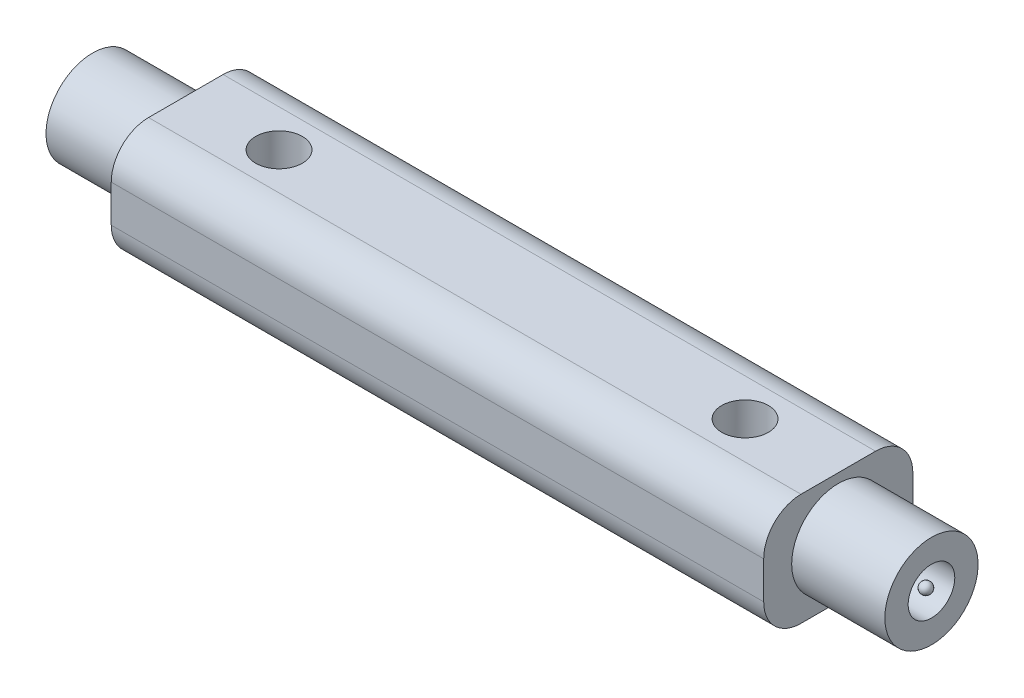
ISO-10303-21;
HEADER;
FILE_DESCRIPTION(('STEP AP214'),'2;1');
FILE_NAME('part.step','',(''),(''),'','','');
FILE_SCHEMA(('AUTOMOTIVE_DESIGN { 1 0 10303 214 1 1 1 1 }'));
ENDSEC;
DATA;
#1=APPLICATION_CONTEXT('core data for automotive mechanical design processes');
#2=APPLICATION_PROTOCOL_DEFINITION('international standard','automotive_design',2000,#1);
#3=PRODUCT_CONTEXT('',#1,'mechanical');
#4=PRODUCT('Part','Part','',(#3));
#5=PRODUCT_RELATED_PRODUCT_CATEGORY('part','',(#4));
#6=PRODUCT_DEFINITION_FORMATION('','',#4);
#7=PRODUCT_DEFINITION_CONTEXT('part definition',#1,'design');
#8=PRODUCT_DEFINITION('design','',#6,#7);
#9=PRODUCT_DEFINITION_SHAPE('','',#8);
#10=(LENGTH_UNIT() NAMED_UNIT(*) SI_UNIT(.MILLI.,.METRE.));
#11=(NAMED_UNIT(*) PLANE_ANGLE_UNIT() SI_UNIT($,.RADIAN.));
#12=(NAMED_UNIT(*) SI_UNIT($,.STERADIAN.) SOLID_ANGLE_UNIT());
#13=UNCERTAINTY_MEASURE_WITH_UNIT(LENGTH_MEASURE(1.E-05),#10,'distance_accuracy_value','');
#14=(GEOMETRIC_REPRESENTATION_CONTEXT(3) GLOBAL_UNCERTAINTY_ASSIGNED_CONTEXT((#13)) GLOBAL_UNIT_ASSIGNED_CONTEXT((#10,
#11,#12)) REPRESENTATION_CONTEXT('',''));
#15=CARTESIAN_POINT('',(0.,0.,0.));
#16=DIRECTION('',(0.,0.,1.));
#17=DIRECTION('',(1.,0.,0.));
#18=AXIS2_PLACEMENT_3D('',#15,#16,#17);
#19=CARTESIAN_POINT('',(22.2,0.,0.));
#20=DIRECTION('',(-1.,0.,0.));
#21=DIRECTION('',(0.,0.,-1.));
#22=AXIS2_PLACEMENT_3D('',#19,#20,#21);
#23=SPHERICAL_SURFACE('',#22,0.300000000000002);
#24=CARTESIAN_POINT('',(21.9,0.,0.));
#25=VERTEX_POINT('',#24);
#26=VERTEX_LOOP('',#25);
#27=FACE_BOUND('',#26,.T.);
#28=ADVANCED_FACE('F40',(#27),#23,.T.);
#29=CLOSED_SHELL('',(#28));
#30=MANIFOLD_SOLID_BREP('B2',#29);
#31=CARTESIAN_POINT('',(-22.2,0.,0.));
#32=DIRECTION('',(-1.,0.,0.));
#33=DIRECTION('',(0.,0.,-1.));
#34=AXIS2_PLACEMENT_3D('',#31,#32,#33);
#35=SPHERICAL_SURFACE('',#34,0.300000000000002);
#36=CARTESIAN_POINT('',(-22.5,0.,0.));
#37=VERTEX_POINT('',#36);
#38=VERTEX_LOOP('',#37);
#39=FACE_BOUND('',#38,.T.);
#40=ADVANCED_FACE('F62',(#39),#35,.T.);
#41=CLOSED_SHELL('',(#40));
#42=MANIFOLD_SOLID_BREP('B6',#41);
#43=CARTESIAN_POINT('',(22.5,0.,0.));
#44=DIRECTION('',(1.,0.,0.));
#45=DIRECTION('',(0.,0.,-1.));
#46=AXIS2_PLACEMENT_3D('',#43,#44,#45);
#47=CYLINDRICAL_SURFACE('',#46,1.24999999999999);
#48=CARTESIAN_POINT('',(12.5,0.,0.));
#49=DIRECTION('',(0.707106781186547,-0.707106781186547,0.));
#50=DIRECTION('',(0.707106781186547,0.707106781186547,0.));
#51=AXIS2_PLACEMENT_3D('',#48,#49,#50);
#52=ELLIPSE('',#51,1.76776695296635,1.24999999999999);
#53=CARTESIAN_POINT('',(12.5,0.,1.24999999999999));
#54=VERTEX_POINT('',#53);
#55=CARTESIAN_POINT('',(12.5,0.,-1.24999999999999));
#56=VERTEX_POINT('',#55);
#57=EDGE_CURVE('E168',#54,#56,#52,.T.);
#58=ORIENTED_EDGE('',*,*,#57,.T.);
#59=CARTESIAN_POINT('',(12.5,0.,0.));
#60=DIRECTION('',(0.707106781186547,0.707106781186547,0.));
#61=DIRECTION('',(0.707106781186547,-0.707106781186547,0.));
#62=AXIS2_PLACEMENT_3D('',#59,#60,#61);
#63=ELLIPSE('',#62,1.76776695296635,1.24999999999999);
#64=EDGE_CURVE('E165',#56,#54,#63,.T.);
#65=ORIENTED_EDGE('',*,*,#64,.T.);
#66=EDGE_LOOP('',(#58,#65));
#67=FACE_BOUND('',#66,.T.);
#68=CARTESIAN_POINT('',(-12.5,0.,0.));
#69=DIRECTION('',(0.707106781186547,-0.707106781186547,0.));
#70=DIRECTION('',(0.707106781186547,0.707106781186547,0.));
#71=AXIS2_PLACEMENT_3D('',#68,#69,#70);
#72=ELLIPSE('',#71,1.76776695296635,1.24999999999999);
#73=CARTESIAN_POINT('',(-12.5,0.,1.24999999999999));
#74=VERTEX_POINT('',#73);
#75=CARTESIAN_POINT('',(-12.5,0.,-1.24999999999999));
#76=VERTEX_POINT('',#75);
#77=EDGE_CURVE('E87',#74,#76,#72,.F.);
#78=ORIENTED_EDGE('',*,*,#77,.T.);
#79=CARTESIAN_POINT('',(-12.5,0.,0.));
#80=DIRECTION('',(0.707106781186547,0.707106781186547,0.));
#81=DIRECTION('',(0.707106781186547,-0.707106781186547,0.));
#82=AXIS2_PLACEMENT_3D('',#79,#80,#81);
#83=ELLIPSE('',#82,1.76776695296635,1.24999999999999);
#84=EDGE_CURVE('E60',#76,#74,#83,.F.);
#85=ORIENTED_EDGE('',*,*,#84,.T.);
#86=EDGE_LOOP('',(#78,#85));
#87=FACE_BOUND('',#86,.T.);
#88=ADVANCED_FACE('F74',(#67,#87),#47,.F.);
#89=CARTESIAN_POINT('',(22.5,0.,0.));
#90=DIRECTION('',(1.,0.,0.));
#91=DIRECTION('',(0.,0.,-1.));
#92=AXIS2_PLACEMENT_3D('',#89,#90,#91);
#93=CIRCLE('',#92,1.24999999999999);
#94=CARTESIAN_POINT('',(22.5,0.,-1.24999999999999));
#95=VERTEX_POINT('',#94);
#96=EDGE_CURVE('E247',#95,#95,#93,.T.);
#97=ORIENTED_EDGE('',*,*,#96,.T.);
#98=EDGE_LOOP('',(#97));
#99=FACE_BOUND('',#98,.T.);
#100=CARTESIAN_POINT('',(12.5,0.,0.));
#101=DIRECTION('',(0.707106781186547,-0.707106781186547,0.));
#102=DIRECTION('',(0.707106781186547,0.707106781186547,0.));
#103=AXIS2_PLACEMENT_3D('',#100,#101,#102);
#104=ELLIPSE('',#103,1.76776695296635,1.24999999999999);
#105=EDGE_CURVE('E94',#54,#56,#104,.F.);
#106=ORIENTED_EDGE('',*,*,#105,.T.);
#107=CARTESIAN_POINT('',(12.5,0.,0.));
#108=DIRECTION('',(0.707106781186547,0.707106781186547,0.));
#109=DIRECTION('',(0.707106781186547,-0.707106781186547,0.));
#110=AXIS2_PLACEMENT_3D('',#107,#108,#109);
#111=ELLIPSE('',#110,1.76776695296635,1.24999999999999);
#112=EDGE_CURVE('E159',#56,#54,#111,.F.);
#113=ORIENTED_EDGE('',*,*,#112,.T.);
#114=EDGE_LOOP('',(#106,#113));
#115=FACE_BOUND('',#114,.T.);
#116=ADVANCED_FACE('F311',(#99,#115),#47,.F.);
#117=CARTESIAN_POINT('',(17.5,0.,0.));
#118=DIRECTION('',(1.,0.,0.));
#119=DIRECTION('',(0.,0.,-1.));
#120=AXIS2_PLACEMENT_3D('',#117,#118,#119);
#121=PLANE('',#120);
#122=DIRECTION('',(0.,0.,-1.));
#123=VECTOR('',#122,1.);
#124=CARTESIAN_POINT('',(17.5,-3.,4.));
#125=LINE('',#124,#123);
#126=CARTESIAN_POINT('',(17.5,-3.,2.));
#127=VERTEX_POINT('',#126);
#128=CARTESIAN_POINT('',(17.5,-3.,-2.));
#129=VERTEX_POINT('',#128);
#130=EDGE_CURVE('E231',#127,#129,#125,.T.);
#131=ORIENTED_EDGE('',*,*,#130,.T.);
#132=CARTESIAN_POINT('',(17.5,-1.,-2.));
#133=DIRECTION('',(1.,0.,0.));
#134=DIRECTION('',(0.,0.,-1.));
#135=AXIS2_PLACEMENT_3D('',#132,#133,#134);
#136=CIRCLE('',#135,2.);
#137=CARTESIAN_POINT('',(17.5,-1.,-4.));
#138=VERTEX_POINT('',#137);
#139=EDGE_CURVE('E182',#129,#138,#136,.T.);
#140=ORIENTED_EDGE('',*,*,#139,.T.);
#141=DIRECTION('',(0.,1.,0.));
#142=VECTOR('',#141,1.);
#143=CARTESIAN_POINT('',(17.5,3.,-4.));
#144=LINE('',#143,#142);
#145=CARTESIAN_POINT('',(17.5,1.,-4.));
#146=VERTEX_POINT('',#145);
#147=EDGE_CURVE('E228',#138,#146,#144,.T.);
#148=ORIENTED_EDGE('',*,*,#147,.T.);
#149=CARTESIAN_POINT('',(17.5,1.,-2.));
#150=DIRECTION('',(1.,0.,0.));
#151=DIRECTION('',(0.,0.,-1.));
#152=AXIS2_PLACEMENT_3D('',#149,#150,#151);
#153=CIRCLE('',#152,2.);
#154=CARTESIAN_POINT('',(17.5,3.,-2.));
#155=VERTEX_POINT('',#154);
#156=EDGE_CURVE('E184',#146,#155,#153,.T.);
#157=ORIENTED_EDGE('',*,*,#156,.T.);
#158=DIRECTION('',(0.,0.,1.));
#159=VECTOR('',#158,1.);
#160=CARTESIAN_POINT('',(17.5,3.,4.));
#161=LINE('',#160,#159);
#162=CARTESIAN_POINT('',(17.5,3.,2.));
#163=VERTEX_POINT('',#162);
#164=EDGE_CURVE('E211',#155,#163,#161,.T.);
#165=ORIENTED_EDGE('',*,*,#164,.T.);
#166=CARTESIAN_POINT('',(17.5,1.,2.));
#167=DIRECTION('',(1.,0.,0.));
#168=DIRECTION('',(0.,0.,-1.));
#169=AXIS2_PLACEMENT_3D('',#166,#167,#168);
#170=CIRCLE('',#169,2.);
#171=CARTESIAN_POINT('',(17.5,1.,4.));
#172=VERTEX_POINT('',#171);
#173=EDGE_CURVE('E188',#163,#172,#170,.T.);
#174=ORIENTED_EDGE('',*,*,#173,.T.);
#175=DIRECTION('',(0.,-1.,0.));
#176=VECTOR('',#175,1.);
#177=CARTESIAN_POINT('',(17.5,3.,4.));
#178=LINE('',#177,#176);
#179=CARTESIAN_POINT('',(17.5,-1.,4.));
#180=VERTEX_POINT('',#179);
#181=EDGE_CURVE('E215',#172,#180,#178,.T.);
#182=ORIENTED_EDGE('',*,*,#181,.T.);
#183=CARTESIAN_POINT('',(17.5,-1.,2.));
#184=DIRECTION('',(1.,0.,0.));
#185=DIRECTION('',(0.,0.,-1.));
#186=AXIS2_PLACEMENT_3D('',#183,#184,#185);
#187=CIRCLE('',#186,2.);
#188=EDGE_CURVE('E186',#180,#127,#187,.T.);
#189=ORIENTED_EDGE('',*,*,#188,.T.);
#190=EDGE_LOOP('',(#131,#140,#148,#157,#165,#174,#182,#189));
#191=FACE_BOUND('',#190,.T.);
#192=CARTESIAN_POINT('',(17.5,0.,0.));
#193=DIRECTION('',(1.,0.,0.));
#194=DIRECTION('',(0.,0.,-1.));
#195=AXIS2_PLACEMENT_3D('',#192,#193,#194);
#196=CIRCLE('',#195,2.5);
#197=CARTESIAN_POINT('',(17.5,0.,2.5));
#198=VERTEX_POINT('',#197);
#199=EDGE_CURVE('E225',#198,#198,#196,.F.);
#200=ORIENTED_EDGE('',*,*,#199,.T.);
#201=EDGE_LOOP('',(#200));
#202=FACE_BOUND('',#201,.T.);
#203=ADVANCED_FACE('F308',(#191,#202),#121,.T.);
#204=CARTESIAN_POINT('',(-17.5,0.,0.));
#205=DIRECTION('',(1.,0.,0.));
#206=DIRECTION('',(0.,0.,-1.));
#207=AXIS2_PLACEMENT_3D('',#204,#205,#206);
#208=PLANE('',#207);
#209=DIRECTION('',(0.,1.,0.));
#210=VECTOR('',#209,1.);
#211=CARTESIAN_POINT('',(-17.5,3.,-4.));
#212=LINE('',#211,#210);
#213=CARTESIAN_POINT('',(-17.5,-1.,-4.));
#214=VERTEX_POINT('',#213);
#215=CARTESIAN_POINT('',(-17.5,1.,-4.));
#216=VERTEX_POINT('',#215);
#217=EDGE_CURVE('E216',#214,#216,#212,.T.);
#218=ORIENTED_EDGE('',*,*,#217,.F.);
#219=CARTESIAN_POINT('',(-17.5,-1.,-2.));
#220=DIRECTION('',(1.,0.,0.));
#221=DIRECTION('',(0.,0.,-1.));
#222=AXIS2_PLACEMENT_3D('',#219,#220,#221);
#223=CIRCLE('',#222,2.);
#224=CARTESIAN_POINT('',(-17.5,-3.,-2.));
#225=VERTEX_POINT('',#224);
#226=EDGE_CURVE('E195',#214,#225,#223,.F.);
#227=ORIENTED_EDGE('',*,*,#226,.T.);
#228=DIRECTION('',(0.,0.,-1.));
#229=VECTOR('',#228,1.);
#230=CARTESIAN_POINT('',(-17.5,-3.,4.));
#231=LINE('',#230,#229);
#232=CARTESIAN_POINT('',(-17.5,-3.,2.));
#233=VERTEX_POINT('',#232);
#234=EDGE_CURVE('E219',#233,#225,#231,.T.);
#235=ORIENTED_EDGE('',*,*,#234,.F.);
#236=CARTESIAN_POINT('',(-17.5,-1.,2.));
#237=DIRECTION('',(1.,0.,0.));
#238=DIRECTION('',(0.,0.,-1.));
#239=AXIS2_PLACEMENT_3D('',#236,#237,#238);
#240=CIRCLE('',#239,2.);
#241=CARTESIAN_POINT('',(-17.5,-1.,4.));
#242=VERTEX_POINT('',#241);
#243=EDGE_CURVE('E199',#233,#242,#240,.F.);
#244=ORIENTED_EDGE('',*,*,#243,.T.);
#245=DIRECTION('',(0.,-1.,0.));
#246=VECTOR('',#245,1.);
#247=CARTESIAN_POINT('',(-17.5,3.,4.));
#248=LINE('',#247,#246);
#249=CARTESIAN_POINT('',(-17.5,1.,4.));
#250=VERTEX_POINT('',#249);
#251=EDGE_CURVE('E222',#250,#242,#248,.T.);
#252=ORIENTED_EDGE('',*,*,#251,.F.);
#253=CARTESIAN_POINT('',(-17.5,1.,2.));
#254=DIRECTION('',(1.,0.,0.));
#255=DIRECTION('',(0.,0.,-1.));
#256=AXIS2_PLACEMENT_3D('',#253,#254,#255);
#257=CIRCLE('',#256,2.);
#258=CARTESIAN_POINT('',(-17.5,3.,2.));
#259=VERTEX_POINT('',#258);
#260=EDGE_CURVE('E201',#250,#259,#257,.F.);
#261=ORIENTED_EDGE('',*,*,#260,.T.);
#262=DIRECTION('',(0.,0.,1.));
#263=VECTOR('',#262,1.);
#264=CARTESIAN_POINT('',(-17.5,3.,4.));
#265=LINE('',#264,#263);
#266=CARTESIAN_POINT('',(-17.5,3.,-2.));
#267=VERTEX_POINT('',#266);
#268=EDGE_CURVE('E212',#267,#259,#265,.T.);
#269=ORIENTED_EDGE('',*,*,#268,.F.);
#270=CARTESIAN_POINT('',(-17.5,1.,-2.));
#271=DIRECTION('',(1.,0.,0.));
#272=DIRECTION('',(0.,0.,-1.));
#273=AXIS2_PLACEMENT_3D('',#270,#271,#272);
#274=CIRCLE('',#273,2.);
#275=EDGE_CURVE('E197',#267,#216,#274,.F.);
#276=ORIENTED_EDGE('',*,*,#275,.T.);
#277=EDGE_LOOP('',(#218,#227,#235,#244,#252,#261,#269,#276));
#278=FACE_BOUND('',#277,.T.);
#279=CARTESIAN_POINT('',(-17.5,0.,0.));
#280=DIRECTION('',(1.,0.,0.));
#281=DIRECTION('',(0.,0.,-1.));
#282=AXIS2_PLACEMENT_3D('',#279,#280,#281);
#283=CIRCLE('',#282,2.5);
#284=CARTESIAN_POINT('',(-17.5,0.,2.5));
#285=VERTEX_POINT('',#284);
#286=EDGE_CURVE('E208',#285,#285,#283,.F.);
#287=ORIENTED_EDGE('',*,*,#286,.F.);
#288=EDGE_LOOP('',(#287));
#289=FACE_BOUND('',#288,.T.);
#290=ADVANCED_FACE('F284',(#278,#289),#208,.F.);
#291=CARTESIAN_POINT('',(17.5,3.,4.));
#292=DIRECTION('',(0.,0.,-1.));
#293=DIRECTION('',(-1.,0.,0.));
#294=AXIS2_PLACEMENT_3D('',#291,#292,#293);
#295=PLANE('',#294);
#296=ORIENTED_EDGE('',*,*,#251,.T.);
#297=DIRECTION('',(-1.,0.,0.));
#298=VECTOR('',#297,1.);
#299=CARTESIAN_POINT('',(17.5,-1.,4.));
#300=LINE('',#299,#298);
#301=EDGE_CURVE('E172',#242,#180,#300,.F.);
#302=ORIENTED_EDGE('',*,*,#301,.T.);
#303=ORIENTED_EDGE('',*,*,#181,.F.);
#304=DIRECTION('',(-1.,0.,0.));
#305=VECTOR('',#304,1.);
#306=CARTESIAN_POINT('',(17.5,1.,4.));
#307=LINE('',#306,#305);
#308=EDGE_CURVE('E174',#172,#250,#307,.T.);
#309=ORIENTED_EDGE('',*,*,#308,.T.);
#310=EDGE_LOOP('',(#296,#302,#303,#309));
#311=FACE_BOUND('',#310,.T.);
#312=ADVANCED_FACE('F304',(#311),#295,.F.);
#313=CARTESIAN_POINT('',(17.5,-3.,4.));
#314=DIRECTION('',(0.,1.,0.));
#315=DIRECTION('',(0.,0.,1.));
#316=AXIS2_PLACEMENT_3D('',#313,#314,#315);
#317=PLANE('',#316);
#318=CARTESIAN_POINT('',(-12.5,-3.,0.));
#319=DIRECTION('',(0.,1.,0.));
#320=DIRECTION('',(0.,0.,1.));
#321=AXIS2_PLACEMENT_3D('',#318,#319,#320);
#322=CIRCLE('',#321,1.24999999999999);
#323=CARTESIAN_POINT('',(-12.5,-3.,1.24999999999999));
#324=VERTEX_POINT('',#323);
#325=EDGE_CURVE('E256',#324,#324,#322,.T.);
#326=ORIENTED_EDGE('',*,*,#325,.T.);
#327=EDGE_LOOP('',(#326));
#328=FACE_BOUND('',#327,.T.);
#329=CARTESIAN_POINT('',(12.5,-3.,0.));
#330=DIRECTION('',(0.,1.,0.));
#331=DIRECTION('',(0.,0.,1.));
#332=AXIS2_PLACEMENT_3D('',#329,#330,#331);
#333=CIRCLE('',#332,1.24999999999999);
#334=CARTESIAN_POINT('',(12.5,-3.,1.24999999999999));
#335=VERTEX_POINT('',#334);
#336=EDGE_CURVE('E250',#335,#335,#333,.T.);
#337=ORIENTED_EDGE('',*,*,#336,.T.);
#338=EDGE_LOOP('',(#337));
#339=FACE_BOUND('',#338,.T.);
#340=ORIENTED_EDGE('',*,*,#234,.T.);
#341=DIRECTION('',(-1.,0.,0.));
#342=VECTOR('',#341,1.);
#343=CARTESIAN_POINT('',(17.5,-3.,-2.));
#344=LINE('',#343,#342);
#345=EDGE_CURVE('E190',#225,#129,#344,.F.);
#346=ORIENTED_EDGE('',*,*,#345,.T.);
#347=ORIENTED_EDGE('',*,*,#130,.F.);
#348=DIRECTION('',(-1.,0.,0.));
#349=VECTOR('',#348,1.);
#350=CARTESIAN_POINT('',(17.5,-3.,2.));
#351=LINE('',#350,#349);
#352=EDGE_CURVE('E192',#127,#233,#351,.T.);
#353=ORIENTED_EDGE('',*,*,#352,.T.);
#354=EDGE_LOOP('',(#340,#346,#347,#353));
#355=FACE_BOUND('',#354,.T.);
#356=ADVANCED_FACE('F295',(#328,#339,#355),#317,.F.);
#357=CARTESIAN_POINT('',(17.5,3.,-4.));
#358=DIRECTION('',(0.,0.,1.));
#359=DIRECTION('',(1.,0.,0.));
#360=AXIS2_PLACEMENT_3D('',#357,#358,#359);
#361=PLANE('',#360);
#362=ORIENTED_EDGE('',*,*,#147,.F.);
#363=DIRECTION('',(-1.,0.,0.));
#364=VECTOR('',#363,1.);
#365=CARTESIAN_POINT('',(17.5,-1.,-4.));
#366=LINE('',#365,#364);
#367=EDGE_CURVE('E203',#138,#214,#366,.T.);
#368=ORIENTED_EDGE('',*,*,#367,.T.);
#369=ORIENTED_EDGE('',*,*,#217,.T.);
#370=DIRECTION('',(-1.,0.,0.));
#371=VECTOR('',#370,1.);
#372=CARTESIAN_POINT('',(17.5,1.,-4.));
#373=LINE('',#372,#371);
#374=EDGE_CURVE('E206',#216,#146,#373,.F.);
#375=ORIENTED_EDGE('',*,*,#374,.T.);
#376=EDGE_LOOP('',(#362,#368,#369,#375));
#377=FACE_BOUND('',#376,.T.);
#378=ADVANCED_FACE('F268',(#377),#361,.F.);
#379=CARTESIAN_POINT('',(17.5,3.,4.));
#380=DIRECTION('',(0.,-1.,0.));
#381=DIRECTION('',(0.,0.,-1.));
#382=AXIS2_PLACEMENT_3D('',#379,#380,#381);
#383=PLANE('',#382);
#384=CARTESIAN_POINT('',(-12.5,3.,0.));
#385=DIRECTION('',(0.,1.,0.));
#386=DIRECTION('',(0.,0.,1.));
#387=AXIS2_PLACEMENT_3D('',#384,#385,#386);
#388=CIRCLE('',#387,1.24999999999999);
#389=CARTESIAN_POINT('',(-12.5,3.,1.24999999999999));
#390=VERTEX_POINT('',#389);
#391=EDGE_CURVE('E259',#390,#390,#388,.T.);
#392=ORIENTED_EDGE('',*,*,#391,.F.);
#393=EDGE_LOOP('',(#392));
#394=FACE_BOUND('',#393,.T.);
#395=CARTESIAN_POINT('',(12.5,3.,0.));
#396=DIRECTION('',(0.,1.,0.));
#397=DIRECTION('',(0.,0.,1.));
#398=AXIS2_PLACEMENT_3D('',#395,#396,#397);
#399=CIRCLE('',#398,1.24999999999999);
#400=CARTESIAN_POINT('',(12.5,3.,1.24999999999999));
#401=VERTEX_POINT('',#400);
#402=EDGE_CURVE('E253',#401,#401,#399,.T.);
#403=ORIENTED_EDGE('',*,*,#402,.F.);
#404=EDGE_LOOP('',(#403));
#405=FACE_BOUND('',#404,.T.);
#406=ORIENTED_EDGE('',*,*,#164,.F.);
#407=DIRECTION('',(-1.,0.,0.));
#408=VECTOR('',#407,1.);
#409=CARTESIAN_POINT('',(17.5,3.,-2.));
#410=LINE('',#409,#408);
#411=EDGE_CURVE('E177',#155,#267,#410,.T.);
#412=ORIENTED_EDGE('',*,*,#411,.T.);
#413=ORIENTED_EDGE('',*,*,#268,.T.);
#414=DIRECTION('',(-1.,0.,0.));
#415=VECTOR('',#414,1.);
#416=CARTESIAN_POINT('',(17.5,3.,2.));
#417=LINE('',#416,#415);
#418=EDGE_CURVE('E180',#259,#163,#417,.F.);
#419=ORIENTED_EDGE('',*,*,#418,.T.);
#420=EDGE_LOOP('',(#406,#412,#413,#419));
#421=FACE_BOUND('',#420,.T.);
#422=ADVANCED_FACE('F264',(#394,#405,#421),#383,.F.);
#423=CARTESIAN_POINT('',(-22.5,0.,0.));
#424=DIRECTION('',(1.,0.,0.));
#425=DIRECTION('',(0.,0.,-1.));
#426=AXIS2_PLACEMENT_3D('',#423,#424,#425);
#427=PLANE('',#426);
#428=CARTESIAN_POINT('',(-22.5,0.,0.));
#429=DIRECTION('',(1.,0.,0.));
#430=DIRECTION('',(0.,0.,-1.));
#431=AXIS2_PLACEMENT_3D('',#428,#429,#430);
#432=CIRCLE('',#431,1.24999999999999);
#433=CARTESIAN_POINT('',(-22.5,0.,-1.24999999999999));
#434=VERTEX_POINT('',#433);
#435=EDGE_CURVE('E242',#434,#434,#432,.T.);
#436=ORIENTED_EDGE('',*,*,#435,.T.);
#437=EDGE_LOOP('',(#436));
#438=FACE_BOUND('',#437,.T.);
#439=CARTESIAN_POINT('',(-22.5,0.,0.));
#440=DIRECTION('',(1.,0.,0.));
#441=DIRECTION('',(0.,0.,-1.));
#442=AXIS2_PLACEMENT_3D('',#439,#440,#441);
#443=CIRCLE('',#442,2.5);
#444=CARTESIAN_POINT('',(-22.5,0.,2.5));
#445=VERTEX_POINT('',#444);
#446=EDGE_CURVE('E239',#445,#445,#443,.T.);
#447=ORIENTED_EDGE('',*,*,#446,.F.);
#448=EDGE_LOOP('',(#447));
#449=FACE_BOUND('',#448,.T.);
#450=ADVANCED_FACE('F267',(#438,#449),#427,.F.);
#451=CARTESIAN_POINT('',(22.5,0.,0.));
#452=DIRECTION('',(-1.,0.,0.));
#453=DIRECTION('',(0.,0.,1.));
#454=AXIS2_PLACEMENT_3D('',#451,#452,#453);
#455=CYLINDRICAL_SURFACE('',#454,2.5);
#456=CARTESIAN_POINT('',(-22.5,0.,2.5));
#457=CARTESIAN_POINT('',(-22.4479166666667,0.,2.5));
#458=CARTESIAN_POINT('',(-22.3958333333333,0.,2.5));
#459=CARTESIAN_POINT('',(-22.2916666666667,0.,2.5));
#460=CARTESIAN_POINT('',(-22.2395833333333,0.,2.5));
#461=CARTESIAN_POINT('',(-22.1354166666667,0.,2.5));
#462=CARTESIAN_POINT('',(-22.0833333333333,0.,2.5));
#463=CARTESIAN_POINT('',(-21.9791666666667,0.,2.5));
#464=CARTESIAN_POINT('',(-21.9270833333333,0.,2.5));
#465=CARTESIAN_POINT('',(-21.8229166666667,0.,2.5));
#466=CARTESIAN_POINT('',(-21.7708333333333,0.,2.5));
#467=CARTESIAN_POINT('',(-21.6666666666667,0.,2.5));
#468=CARTESIAN_POINT('',(-21.6145833333333,0.,2.5));
#469=CARTESIAN_POINT('',(-21.5104166666667,0.,2.5));
#470=CARTESIAN_POINT('',(-21.4583333333333,0.,2.5));
#471=CARTESIAN_POINT('',(-21.3541666666667,0.,2.5));
#472=CARTESIAN_POINT('',(-21.3020833333333,0.,2.5));
#473=CARTESIAN_POINT('',(-21.1979166666667,0.,2.5));
#474=CARTESIAN_POINT('',(-21.1458333333333,0.,2.5));
#475=CARTESIAN_POINT('',(-21.0416666666667,0.,2.5));
#476=CARTESIAN_POINT('',(-20.9895833333333,0.,2.5));
#477=CARTESIAN_POINT('',(-20.8854166666667,0.,2.5));
#478=CARTESIAN_POINT('',(-20.8333333333333,0.,2.5));
#479=CARTESIAN_POINT('',(-20.7291666666667,0.,2.5));
#480=CARTESIAN_POINT('',(-20.6770833333333,0.,2.5));
#481=CARTESIAN_POINT('',(-20.5729166666667,0.,2.5));
#482=CARTESIAN_POINT('',(-20.5208333333333,0.,2.5));
#483=CARTESIAN_POINT('',(-20.4166666666667,0.,2.5));
#484=CARTESIAN_POINT('',(-20.3645833333333,0.,2.5));
#485=CARTESIAN_POINT('',(-20.2604166666667,0.,2.5));
#486=CARTESIAN_POINT('',(-20.2083333333333,0.,2.5));
#487=CARTESIAN_POINT('',(-20.1041666666667,0.,2.5));
#488=CARTESIAN_POINT('',(-20.0520833333333,0.,2.5));
#489=CARTESIAN_POINT('',(-19.9479166666667,0.,2.5));
#490=CARTESIAN_POINT('',(-19.8958333333333,0.,2.5));
#491=CARTESIAN_POINT('',(-19.7916666666667,0.,2.5));
#492=CARTESIAN_POINT('',(-19.7395833333333,0.,2.5));
#493=CARTESIAN_POINT('',(-19.6354166666667,0.,2.5));
#494=CARTESIAN_POINT('',(-19.5833333333333,0.,2.5));
#495=CARTESIAN_POINT('',(-19.4791666666667,0.,2.5));
#496=CARTESIAN_POINT('',(-19.4270833333333,0.,2.5));
#497=CARTESIAN_POINT('',(-19.3229166666667,0.,2.5));
#498=CARTESIAN_POINT('',(-19.2708333333333,0.,2.5));
#499=CARTESIAN_POINT('',(-19.1666666666667,0.,2.5));
#500=CARTESIAN_POINT('',(-19.1145833333333,0.,2.5));
#501=CARTESIAN_POINT('',(-19.0104166666667,0.,2.5));
#502=CARTESIAN_POINT('',(-18.9583333333333,0.,2.5));
#503=CARTESIAN_POINT('',(-18.8541666666667,0.,2.5));
#504=CARTESIAN_POINT('',(-18.8020833333333,0.,2.5));
#505=CARTESIAN_POINT('',(-18.6979166666667,0.,2.5));
#506=CARTESIAN_POINT('',(-18.6458333333333,0.,2.5));
#507=CARTESIAN_POINT('',(-18.5416666666667,0.,2.5));
#508=CARTESIAN_POINT('',(-18.4895833333333,0.,2.5));
#509=CARTESIAN_POINT('',(-18.3854166666667,0.,2.5));
#510=CARTESIAN_POINT('',(-18.3333333333333,0.,2.5));
#511=CARTESIAN_POINT('',(-18.2291666666667,0.,2.5));
#512=CARTESIAN_POINT('',(-18.1770833333333,0.,2.5));
#513=CARTESIAN_POINT('',(-18.0729166666667,0.,2.5));
#514=CARTESIAN_POINT('',(-18.0208333333333,0.,2.5));
#515=CARTESIAN_POINT('',(-17.9166666666667,0.,2.5));
#516=CARTESIAN_POINT('',(-17.8645833333333,0.,2.5));
#517=CARTESIAN_POINT('',(-17.7604166666667,0.,2.5));
#518=CARTESIAN_POINT('',(-17.7083333333333,0.,2.5));
#519=CARTESIAN_POINT('',(-17.6041666666667,0.,2.5));
#520=CARTESIAN_POINT('',(-17.5520833333333,0.,2.5));
#521=CARTESIAN_POINT('',(-17.5,0.,2.5));
#522=B_SPLINE_CURVE_WITH_KNOTS('',3,(#456,#457,#458,#459,#460,#461,#462,#463,#464,#465,#466,
#467,#468,#469,#470,#471,#472,#473,#474,#475,#476,#477,#478,#479,#480,#481,#482,#483,#484,#485,
#486,#487,#488,#489,#490,#491,#492,#493,#494,#495,#496,#497,#498,#499,#500,#501,#502,#503,#504,
#505,#506,#507,#508,#509,#510,#511,#512,#513,#514,#515,#516,#517,#518,#519,#520,#521),
.UNSPECIFIED.,.F.,.F.,(4,2,2,2,2,2,2,2,2,2,2,2,2,2,2,2,2,2,2,2,2,2,2,2,2,2,2,2,2,2,2,2,4),(0.,
0.156249999999997,0.3125,0.468750000000004,0.625000000000001,0.781249999999997,
0.937500000000001,1.09375,1.25,1.40625,1.5625,1.71875,1.875,2.03125,2.1875,2.34375000000001,2.5,
2.65625,2.8125,2.96875000000001,3.125,3.28125,3.4375,3.59375000000001,3.75,3.90625,4.0625,
4.21875000000001,4.375,4.53125,4.6875,4.84375000000001,5.),.UNSPECIFIED.);
#523=EDGE_CURVE('BSEAM319',#445,#285,#522,.T.);
#524=ORIENTED_EDGE('',*,*,#446,.T.);
#525=ORIENTED_EDGE('',*,*,#286,.T.);
#526=ORIENTED_EDGE('',*,*,#523,.T.);
#527=ORIENTED_EDGE('',*,*,#523,.F.);
#528=EDGE_LOOP('',(#524,#526,#525,#527));
#529=FACE_BOUND('',#528,.T.);
#530=ADVANCED_FACE('F319',(#529),#455,.T.);
#531=CARTESIAN_POINT('',(22.5,0.,0.));
#532=DIRECTION('',(1.,0.,0.));
#533=DIRECTION('',(0.,0.,-1.));
#534=AXIS2_PLACEMENT_3D('',#531,#532,#533);
#535=CIRCLE('',#534,2.5);
#536=CARTESIAN_POINT('',(22.5,0.,2.5));
#537=VERTEX_POINT('',#536);
#538=EDGE_CURVE('E238',#537,#537,#535,.T.);
#539=CARTESIAN_POINT('',(17.5,0.,2.5));
#540=CARTESIAN_POINT('',(17.5520833333333,0.,2.5));
#541=CARTESIAN_POINT('',(17.6041666666667,0.,2.5));
#542=CARTESIAN_POINT('',(17.7083333333333,0.,2.5));
#543=CARTESIAN_POINT('',(17.7604166666667,0.,2.5));
#544=CARTESIAN_POINT('',(17.8645833333333,0.,2.5));
#545=CARTESIAN_POINT('',(17.9166666666667,0.,2.5));
#546=CARTESIAN_POINT('',(18.0208333333333,0.,2.5));
#547=CARTESIAN_POINT('',(18.0729166666667,0.,2.5));
#548=CARTESIAN_POINT('',(18.1770833333333,0.,2.5));
#549=CARTESIAN_POINT('',(18.2291666666667,0.,2.5));
#550=CARTESIAN_POINT('',(18.3333333333333,0.,2.5));
#551=CARTESIAN_POINT('',(18.3854166666667,0.,2.5));
#552=CARTESIAN_POINT('',(18.4895833333333,0.,2.5));
#553=CARTESIAN_POINT('',(18.5416666666667,0.,2.5));
#554=CARTESIAN_POINT('',(18.6458333333333,0.,2.5));
#555=CARTESIAN_POINT('',(18.6979166666667,0.,2.5));
#556=CARTESIAN_POINT('',(18.8020833333333,0.,2.5));
#557=CARTESIAN_POINT('',(18.8541666666667,0.,2.5));
#558=CARTESIAN_POINT('',(18.9583333333333,0.,2.5));
#559=CARTESIAN_POINT('',(19.0104166666667,0.,2.5));
#560=CARTESIAN_POINT('',(19.1145833333333,0.,2.5));
#561=CARTESIAN_POINT('',(19.1666666666667,0.,2.5));
#562=CARTESIAN_POINT('',(19.2708333333333,0.,2.5));
#563=CARTESIAN_POINT('',(19.3229166666667,0.,2.5));
#564=CARTESIAN_POINT('',(19.4270833333333,0.,2.5));
#565=CARTESIAN_POINT('',(19.4791666666667,0.,2.5));
#566=CARTESIAN_POINT('',(19.5833333333333,0.,2.5));
#567=CARTESIAN_POINT('',(19.6354166666667,0.,2.5));
#568=CARTESIAN_POINT('',(19.7395833333333,0.,2.5));
#569=CARTESIAN_POINT('',(19.7916666666667,0.,2.5));
#570=CARTESIAN_POINT('',(19.8958333333333,0.,2.5));
#571=CARTESIAN_POINT('',(19.9479166666667,0.,2.5));
#572=CARTESIAN_POINT('',(20.0520833333333,0.,2.5));
#573=CARTESIAN_POINT('',(20.1041666666667,0.,2.5));
#574=CARTESIAN_POINT('',(20.2083333333333,0.,2.5));
#575=CARTESIAN_POINT('',(20.2604166666667,0.,2.5));
#576=CARTESIAN_POINT('',(20.3645833333333,0.,2.5));
#577=CARTESIAN_POINT('',(20.4166666666667,0.,2.5));
#578=CARTESIAN_POINT('',(20.5208333333333,0.,2.5));
#579=CARTESIAN_POINT('',(20.5729166666667,0.,2.5));
#580=CARTESIAN_POINT('',(20.6770833333333,0.,2.5));
#581=CARTESIAN_POINT('',(20.7291666666667,0.,2.5));
#582=CARTESIAN_POINT('',(20.8333333333333,0.,2.5));
#583=CARTESIAN_POINT('',(20.8854166666667,0.,2.5));
#584=CARTESIAN_POINT('',(20.9895833333333,0.,2.5));
#585=CARTESIAN_POINT('',(21.0416666666667,0.,2.5));
#586=CARTESIAN_POINT('',(21.1458333333333,0.,2.5));
#587=CARTESIAN_POINT('',(21.1979166666667,0.,2.5));
#588=CARTESIAN_POINT('',(21.3020833333333,0.,2.5));
#589=CARTESIAN_POINT('',(21.3541666666667,0.,2.5));
#590=CARTESIAN_POINT('',(21.4583333333333,0.,2.5));
#591=CARTESIAN_POINT('',(21.5104166666667,0.,2.5));
#592=CARTESIAN_POINT('',(21.6145833333333,0.,2.5));
#593=CARTESIAN_POINT('',(21.6666666666667,0.,2.5));
#594=CARTESIAN_POINT('',(21.7708333333333,0.,2.5));
#595=CARTESIAN_POINT('',(21.8229166666667,0.,2.5));
#596=CARTESIAN_POINT('',(21.9270833333333,0.,2.5));
#597=CARTESIAN_POINT('',(21.9791666666667,0.,2.5));
#598=CARTESIAN_POINT('',(22.0833333333333,0.,2.5));
#599=CARTESIAN_POINT('',(22.1354166666667,0.,2.5));
#600=CARTESIAN_POINT('',(22.2395833333333,0.,2.5));
#601=CARTESIAN_POINT('',(22.2916666666667,0.,2.5));
#602=CARTESIAN_POINT('',(22.3958333333333,0.,2.5));
#603=CARTESIAN_POINT('',(22.4479166666667,0.,2.5));
#604=CARTESIAN_POINT('',(22.5,0.,2.5));
#605=B_SPLINE_CURVE_WITH_KNOTS('',3,(#539,#540,#541,#542,#543,#544,#545,#546,#547,#548,#549,
#550,#551,#552,#553,#554,#555,#556,#557,#558,#559,#560,#561,#562,#563,#564,#565,#566,#567,#568,
#569,#570,#571,#572,#573,#574,#575,#576,#577,#578,#579,#580,#581,#582,#583,#584,#585,#586,#587,
#588,#589,#590,#591,#592,#593,#594,#595,#596,#597,#598,#599,#600,#601,#602,#603,#604),
.UNSPECIFIED.,.F.,.F.,(4,2,2,2,2,2,2,2,2,2,2,2,2,2,2,2,2,2,2,2,2,2,2,2,2,2,2,2,2,2,2,2,4),(0.,
0.15625,0.3125,0.46875,0.625000000000001,0.781250000000001,0.937500000000001,1.09375,1.25,
1.40625,1.5625,1.71875,1.875,2.03125,2.1875,2.34375,2.5,2.65625,2.8125,2.96875,3.125,3.28125,
3.4375,3.59375,3.75,3.90625,4.0625,4.21875,4.375,4.53125,4.6875,4.84375,5.),.UNSPECIFIED.);
#606=EDGE_CURVE('BSEAM315',#198,#537,#605,.T.);
#607=ORIENTED_EDGE('',*,*,#199,.F.);
#608=ORIENTED_EDGE('',*,*,#538,.F.);
#609=ORIENTED_EDGE('',*,*,#606,.T.);
#610=ORIENTED_EDGE('',*,*,#606,.F.);
#611=EDGE_LOOP('',(#607,#609,#608,#610));
#612=FACE_BOUND('',#611,.T.);
#613=ADVANCED_FACE('F315',(#612),#455,.T.);
#614=CARTESIAN_POINT('',(22.5,0.,0.));
#615=DIRECTION('',(1.,0.,0.));
#616=DIRECTION('',(0.,0.,-1.));
#617=AXIS2_PLACEMENT_3D('',#614,#615,#616);
#618=PLANE('',#617);
#619=ORIENTED_EDGE('',*,*,#96,.F.);
#620=EDGE_LOOP('',(#619));
#621=FACE_BOUND('',#620,.T.);
#622=ORIENTED_EDGE('',*,*,#538,.T.);
#623=EDGE_LOOP('',(#622));
#624=FACE_BOUND('',#623,.T.);
#625=ADVANCED_FACE('F318',(#621,#624),#618,.T.);
#626=CARTESIAN_POINT('',(17.5,-1.,-2.));
#627=DIRECTION('',(-1.,0.,0.));
#628=DIRECTION('',(0.,0.,1.));
#629=AXIS2_PLACEMENT_3D('',#626,#627,#628);
#630=CYLINDRICAL_SURFACE('',#629,2.);
#631=ORIENTED_EDGE('',*,*,#139,.F.);
#632=ORIENTED_EDGE('',*,*,#345,.F.);
#633=ORIENTED_EDGE('',*,*,#226,.F.);
#634=ORIENTED_EDGE('',*,*,#367,.F.);
#635=EDGE_LOOP('',(#631,#632,#633,#634));
#636=FACE_BOUND('',#635,.T.);
#637=ADVANCED_FACE('F291',(#636),#630,.T.);
#638=CARTESIAN_POINT('',(17.5,1.,-2.));
#639=DIRECTION('',(-1.,0.,0.));
#640=DIRECTION('',(0.,0.,1.));
#641=AXIS2_PLACEMENT_3D('',#638,#639,#640);
#642=CYLINDRICAL_SURFACE('',#641,2.);
#643=ORIENTED_EDGE('',*,*,#156,.F.);
#644=ORIENTED_EDGE('',*,*,#374,.F.);
#645=ORIENTED_EDGE('',*,*,#275,.F.);
#646=ORIENTED_EDGE('',*,*,#411,.F.);
#647=EDGE_LOOP('',(#643,#644,#645,#646));
#648=FACE_BOUND('',#647,.T.);
#649=ADVANCED_FACE('F280',(#648),#642,.T.);
#650=CARTESIAN_POINT('',(17.5,-1.,2.));
#651=DIRECTION('',(-1.,0.,0.));
#652=DIRECTION('',(0.,0.,1.));
#653=AXIS2_PLACEMENT_3D('',#650,#651,#652);
#654=CYLINDRICAL_SURFACE('',#653,2.);
#655=ORIENTED_EDGE('',*,*,#188,.F.);
#656=ORIENTED_EDGE('',*,*,#301,.F.);
#657=ORIENTED_EDGE('',*,*,#243,.F.);
#658=ORIENTED_EDGE('',*,*,#352,.F.);
#659=EDGE_LOOP('',(#655,#656,#657,#658));
#660=FACE_BOUND('',#659,.T.);
#661=ADVANCED_FACE('F300',(#660),#654,.T.);
#662=CARTESIAN_POINT('',(17.5,1.,2.));
#663=DIRECTION('',(-1.,0.,0.));
#664=DIRECTION('',(0.,0.,1.));
#665=AXIS2_PLACEMENT_3D('',#662,#663,#664);
#666=CYLINDRICAL_SURFACE('',#665,2.);
#667=ORIENTED_EDGE('',*,*,#173,.F.);
#668=ORIENTED_EDGE('',*,*,#418,.F.);
#669=ORIENTED_EDGE('',*,*,#260,.F.);
#670=ORIENTED_EDGE('',*,*,#308,.F.);
#671=EDGE_LOOP('',(#667,#668,#669,#670));
#672=FACE_BOUND('',#671,.T.);
#673=ADVANCED_FACE('F76',(#672),#666,.T.);
#674=CARTESIAN_POINT('',(-12.5,0.,0.));
#675=DIRECTION('',(0.707106781186547,-0.707106781186547,0.));
#676=DIRECTION('',(0.707106781186547,0.707106781186547,0.));
#677=AXIS2_PLACEMENT_3D('',#674,#675,#676);
#678=ELLIPSE('',#677,1.76776695296635,1.24999999999999);
#679=EDGE_CURVE('E152',#74,#76,#678,.T.);
#680=ORIENTED_EDGE('',*,*,#679,.T.);
#681=CARTESIAN_POINT('',(-12.5,0.,0.));
#682=DIRECTION('',(0.707106781186547,0.707106781186547,0.));
#683=DIRECTION('',(0.707106781186547,-0.707106781186547,0.));
#684=AXIS2_PLACEMENT_3D('',#681,#682,#683);
#685=ELLIPSE('',#684,1.76776695296635,1.24999999999999);
#686=EDGE_CURVE('E82',#76,#74,#685,.T.);
#687=ORIENTED_EDGE('',*,*,#686,.T.);
#688=EDGE_LOOP('',(#680,#687));
#689=FACE_BOUND('',#688,.T.);
#690=ORIENTED_EDGE('',*,*,#435,.F.);
#691=EDGE_LOOP('',(#690));
#692=FACE_BOUND('',#691,.T.);
#693=ADVANCED_FACE('F161',(#689,#692),#47,.F.);
#694=CARTESIAN_POINT('',(12.5,3.,0.));
#695=DIRECTION('',(0.,1.,0.));
#696=DIRECTION('',(0.,0.,1.));
#697=AXIS2_PLACEMENT_3D('',#694,#695,#696);
#698=CYLINDRICAL_SURFACE('',#697,1.24999999999999);
#699=ORIENTED_EDGE('',*,*,#402,.T.);
#700=EDGE_LOOP('',(#699));
#701=FACE_BOUND('',#700,.T.);
#702=ORIENTED_EDGE('',*,*,#105,.F.);
#703=ORIENTED_EDGE('',*,*,#64,.F.);
#704=EDGE_LOOP('',(#702,#703));
#705=FACE_BOUND('',#704,.T.);
#706=ADVANCED_FACE('F341',(#701,#705),#698,.F.);
#707=ORIENTED_EDGE('',*,*,#336,.F.);
#708=EDGE_LOOP('',(#707));
#709=FACE_BOUND('',#708,.T.);
#710=ORIENTED_EDGE('',*,*,#57,.F.);
#711=ORIENTED_EDGE('',*,*,#112,.F.);
#712=EDGE_LOOP('',(#710,#711));
#713=FACE_BOUND('',#712,.T.);
#714=ADVANCED_FACE('F346',(#709,#713),#698,.F.);
#715=CARTESIAN_POINT('',(-12.5,3.,0.));
#716=DIRECTION('',(0.,1.,0.));
#717=DIRECTION('',(0.,0.,1.));
#718=AXIS2_PLACEMENT_3D('',#715,#716,#717);
#719=CYLINDRICAL_SURFACE('',#718,1.24999999999999);
#720=ORIENTED_EDGE('',*,*,#391,.T.);
#721=EDGE_LOOP('',(#720));
#722=FACE_BOUND('',#721,.T.);
#723=ORIENTED_EDGE('',*,*,#77,.F.);
#724=ORIENTED_EDGE('',*,*,#686,.F.);
#725=EDGE_LOOP('',(#723,#724));
#726=FACE_BOUND('',#725,.T.);
#727=ADVANCED_FACE('F158',(#722,#726),#719,.F.);
#728=ORIENTED_EDGE('',*,*,#325,.F.);
#729=EDGE_LOOP('',(#728));
#730=FACE_BOUND('',#729,.T.);
#731=ORIENTED_EDGE('',*,*,#679,.F.);
#732=ORIENTED_EDGE('',*,*,#84,.F.);
#733=EDGE_LOOP('',(#731,#732));
#734=FACE_BOUND('',#733,.T.);
#735=ADVANCED_FACE('F153',(#730,#734),#719,.F.);
#736=CLOSED_SHELL('',(#88,#116,#203,#290,#312,#356,#378,#422,#450,#530,#613,#625,#637,#649,#661,
#673,#693,#706,#714,#727,#735));
#737=MANIFOLD_SOLID_BREP('B36',#736);
#738=ADVANCED_BREP_SHAPE_REPRESENTATION('',(#18,#30,#42,#737),#14);
#739=SHAPE_DEFINITION_REPRESENTATION(#9,#738);
ENDSEC;
END-ISO-10303-21;
